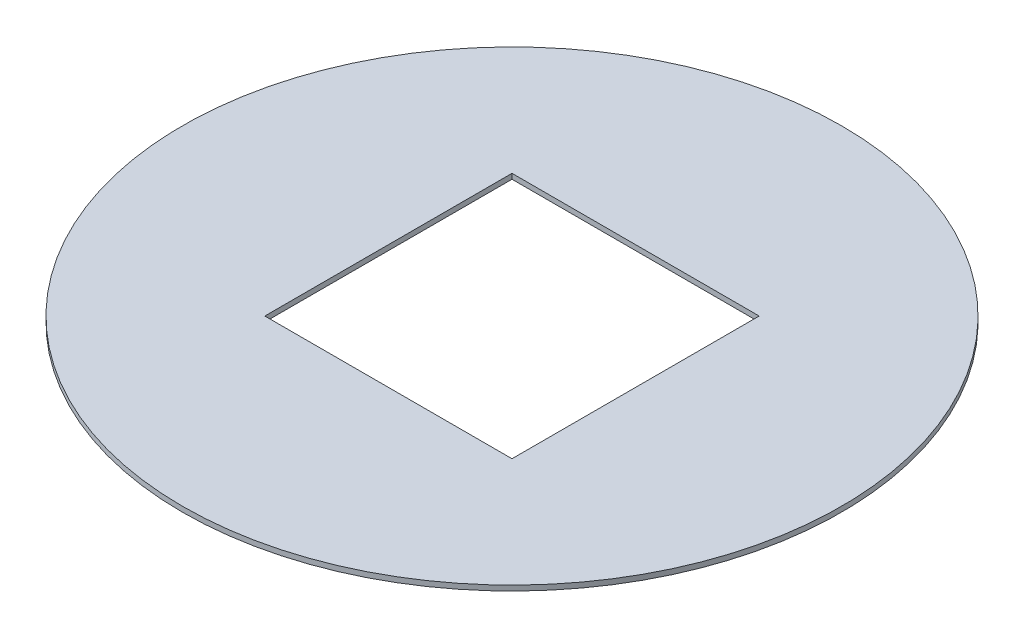
ISO-10303-21;
HEADER;
FILE_DESCRIPTION(('STEP AP214'),'2;1');
FILE_NAME('part.step','',(''),(''),'','','');
FILE_SCHEMA(('AUTOMOTIVE_DESIGN { 1 0 10303 214 1 1 1 1 }'));
ENDSEC;
DATA;
#1=APPLICATION_CONTEXT('core data for automotive mechanical design processes');
#2=APPLICATION_PROTOCOL_DEFINITION('international standard','automotive_design',2000,#1);
#3=PRODUCT_CONTEXT('',#1,'mechanical');
#4=PRODUCT('Part','Part','',(#3));
#5=PRODUCT_RELATED_PRODUCT_CATEGORY('part','',(#4));
#6=PRODUCT_DEFINITION_FORMATION('','',#4);
#7=PRODUCT_DEFINITION_CONTEXT('part definition',#1,'design');
#8=PRODUCT_DEFINITION('design','',#6,#7);
#9=PRODUCT_DEFINITION_SHAPE('','',#8);
#10=(LENGTH_UNIT() NAMED_UNIT(*) SI_UNIT(.MILLI.,.METRE.));
#11=(NAMED_UNIT(*) PLANE_ANGLE_UNIT() SI_UNIT($,.RADIAN.));
#12=(NAMED_UNIT(*) SI_UNIT($,.STERADIAN.) SOLID_ANGLE_UNIT());
#13=UNCERTAINTY_MEASURE_WITH_UNIT(LENGTH_MEASURE(1.E-05),#10,'distance_accuracy_value','');
#14=(GEOMETRIC_REPRESENTATION_CONTEXT(3) GLOBAL_UNCERTAINTY_ASSIGNED_CONTEXT((#13)) GLOBAL_UNIT_ASSIGNED_CONTEXT((#10,
#11,#12)) REPRESENTATION_CONTEXT('',''));
#15=CARTESIAN_POINT('',(0.,0.,0.));
#16=DIRECTION('',(0.,0.,1.));
#17=DIRECTION('',(1.,0.,0.));
#18=AXIS2_PLACEMENT_3D('',#15,#16,#17);
#19=CARTESIAN_POINT('',(-60.,-0.785000000000001,0.));
#20=DIRECTION('',(0.,1.,0.));
#21=DIRECTION('',(0.,0.,1.));
#22=AXIS2_PLACEMENT_3D('',#19,#20,#21);
#23=PLANE('',#22);
#24=CARTESIAN_POINT('',(0.,-0.785000000007585,0.));
#25=DIRECTION('',(0.,-1.,0.));
#26=DIRECTION('',(0.,0.,-1.));
#27=AXIS2_PLACEMENT_3D('',#24,#25,#26);
#28=CIRCLE('',#27,100.);
#29=CARTESIAN_POINT('',(0.,-0.785000000007585,-100.));
#30=VERTEX_POINT('',#29);
#31=EDGE_CURVE('E11',#30,#30,#28,.T.);
#32=ORIENTED_EDGE('',*,*,#31,.T.);
#33=EDGE_LOOP('',(#32));
#34=FACE_BOUND('',#33,.T.);
#35=DIRECTION('',(1.,0.,0.));
#36=VECTOR('',#35,1.);
#37=CARTESIAN_POINT('',(-37.5,-0.785000000000008,-37.5));
#38=LINE('',#37,#36);
#39=CARTESIAN_POINT('',(-37.5,-0.785000000000008,-37.5));
#40=VERTEX_POINT('',#39);
#41=CARTESIAN_POINT('',(37.5,-0.785000000000008,-37.5));
#42=VERTEX_POINT('',#41);
#43=EDGE_CURVE('E53',#40,#42,#38,.T.);
#44=ORIENTED_EDGE('',*,*,#43,.F.);
#45=DIRECTION('',(0.,0.,-1.));
#46=VECTOR('',#45,1.);
#47=CARTESIAN_POINT('',(-37.5,-0.785000000000008,37.5));
#48=LINE('',#47,#46);
#49=CARTESIAN_POINT('',(-37.5,-0.785000000000008,37.5));
#50=VERTEX_POINT('',#49);
#51=EDGE_CURVE('E57',#50,#40,#48,.T.);
#52=ORIENTED_EDGE('',*,*,#51,.F.);
#53=DIRECTION('',(-1.,0.,0.));
#54=VECTOR('',#53,1.);
#55=CARTESIAN_POINT('',(-37.5,-0.785000000000008,37.5));
#56=LINE('',#55,#54);
#57=CARTESIAN_POINT('',(37.5,-0.785000000000008,37.5));
#58=VERTEX_POINT('',#57);
#59=EDGE_CURVE('E111',#58,#50,#56,.T.);
#60=ORIENTED_EDGE('',*,*,#59,.F.);
#61=DIRECTION('',(0.,0.,1.));
#62=VECTOR('',#61,1.);
#63=CARTESIAN_POINT('',(37.5,-0.785000000000008,37.5));
#64=LINE('',#63,#62);
#65=EDGE_CURVE('E107',#42,#58,#64,.T.);
#66=ORIENTED_EDGE('',*,*,#65,.F.);
#67=EDGE_LOOP('',(#44,#52,#60,#66));
#68=FACE_BOUND('',#67,.T.);
#69=ADVANCED_FACE('F39',(#34,#68),#23,.F.);
#70=CARTESIAN_POINT('',(0.,-200069.047495165,0.));
#71=DIRECTION('',(0.,-1.,0.));
#72=DIRECTION('',(0.,0.,-1.));
#73=AXIS2_PLACEMENT_3D('',#70,#71,#72);
#74=CYLINDRICAL_SURFACE('',#73,100.);
#75=ORIENTED_EDGE('',*,*,#31,.F.);
#76=EDGE_LOOP('',(#75));
#77=FACE_BOUND('',#76,.T.);
#78=CARTESIAN_POINT('',(0.,0.785000000007585,0.));
#79=DIRECTION('',(0.,-1.,0.));
#80=DIRECTION('',(0.,0.,-1.));
#81=AXIS2_PLACEMENT_3D('',#78,#79,#80);
#82=CIRCLE('',#81,100.);
#83=CARTESIAN_POINT('',(0.,0.785000000007585,-100.));
#84=VERTEX_POINT('',#83);
#85=EDGE_CURVE('E46',#84,#84,#82,.T.);
#86=ORIENTED_EDGE('',*,*,#85,.T.);
#87=EDGE_LOOP('',(#86));
#88=FACE_BOUND('',#87,.T.);
#89=ADVANCED_FACE('F123',(#77,#88),#74,.T.);
#90=CARTESIAN_POINT('',(-60.,0.785000000000001,0.));
#91=DIRECTION('',(0.,-1.,0.));
#92=DIRECTION('',(0.,0.,-1.));
#93=AXIS2_PLACEMENT_3D('',#90,#91,#92);
#94=PLANE('',#93);
#95=ORIENTED_EDGE('',*,*,#85,.F.);
#96=EDGE_LOOP('',(#95));
#97=FACE_BOUND('',#96,.T.);
#98=DIRECTION('',(0.,0.,-1.));
#99=VECTOR('',#98,1.);
#100=CARTESIAN_POINT('',(37.5,0.785000000000001,37.5));
#101=LINE('',#100,#99);
#102=CARTESIAN_POINT('',(37.5,0.785000000000001,37.5));
#103=VERTEX_POINT('',#102);
#104=CARTESIAN_POINT('',(37.5,0.785000000000001,-37.5));
#105=VERTEX_POINT('',#104);
#106=EDGE_CURVE('E94',#103,#105,#101,.T.);
#107=ORIENTED_EDGE('',*,*,#106,.F.);
#108=DIRECTION('',(1.,0.,0.));
#109=VECTOR('',#108,1.);
#110=CARTESIAN_POINT('',(-37.5,0.785000000000001,37.5));
#111=LINE('',#110,#109);
#112=CARTESIAN_POINT('',(-37.5,0.785000000000001,37.5));
#113=VERTEX_POINT('',#112);
#114=EDGE_CURVE('E98',#113,#103,#111,.T.);
#115=ORIENTED_EDGE('',*,*,#114,.F.);
#116=DIRECTION('',(0.,0.,1.));
#117=VECTOR('',#116,1.);
#118=CARTESIAN_POINT('',(-37.5,0.785000000000001,37.5));
#119=LINE('',#118,#117);
#120=CARTESIAN_POINT('',(-37.5,0.785000000000001,-37.5));
#121=VERTEX_POINT('',#120);
#122=EDGE_CURVE('E81',#121,#113,#119,.T.);
#123=ORIENTED_EDGE('',*,*,#122,.F.);
#124=DIRECTION('',(-1.,0.,0.));
#125=VECTOR('',#124,1.);
#126=CARTESIAN_POINT('',(-37.5,0.785000000000001,-37.5));
#127=LINE('',#126,#125);
#128=EDGE_CURVE('E88',#105,#121,#127,.T.);
#129=ORIENTED_EDGE('',*,*,#128,.F.);
#130=EDGE_LOOP('',(#107,#115,#123,#129));
#131=FACE_BOUND('',#130,.T.);
#132=ADVANCED_FACE('F96',(#97,#131),#94,.F.);
#133=CARTESIAN_POINT('',(-37.5,-170.490627484771,-37.5));
#134=DIRECTION('',(0.,0.,-1.));
#135=DIRECTION('',(-1.,0.,0.));
#136=AXIS2_PLACEMENT_3D('',#133,#134,#135);
#137=PLANE('',#136);
#138=DIRECTION('',(0.,1.,0.));
#139=VECTOR('',#138,1.);
#140=CARTESIAN_POINT('',(-37.5,-170.490627484771,-37.5));
#141=LINE('',#140,#139);
#142=EDGE_CURVE('E77',#40,#121,#141,.T.);
#143=ORIENTED_EDGE('',*,*,#142,.F.);
#144=ORIENTED_EDGE('',*,*,#43,.T.);
#145=DIRECTION('',(0.,1.,0.));
#146=VECTOR('',#145,1.);
#147=CARTESIAN_POINT('',(37.5,-170.490627484771,-37.5));
#148=LINE('',#147,#146);
#149=EDGE_CURVE('E85',#42,#105,#148,.T.);
#150=ORIENTED_EDGE('',*,*,#149,.T.);
#151=ORIENTED_EDGE('',*,*,#128,.T.);
#152=EDGE_LOOP('',(#143,#144,#150,#151));
#153=FACE_BOUND('',#152,.T.);
#154=ADVANCED_FACE('F89',(#153),#137,.F.);
#155=CARTESIAN_POINT('',(-37.5,-170.490627484771,37.5));
#156=DIRECTION('',(-1.,0.,0.));
#157=DIRECTION('',(0.,0.,1.));
#158=AXIS2_PLACEMENT_3D('',#155,#156,#157);
#159=PLANE('',#158);
#160=DIRECTION('',(0.,1.,0.));
#161=VECTOR('',#160,1.);
#162=CARTESIAN_POINT('',(-37.5,-170.490627484771,37.5));
#163=LINE('',#162,#161);
#164=EDGE_CURVE('E84',#50,#113,#163,.T.);
#165=ORIENTED_EDGE('',*,*,#164,.F.);
#166=ORIENTED_EDGE('',*,*,#51,.T.);
#167=ORIENTED_EDGE('',*,*,#142,.T.);
#168=ORIENTED_EDGE('',*,*,#122,.T.);
#169=EDGE_LOOP('',(#165,#166,#167,#168));
#170=FACE_BOUND('',#169,.T.);
#171=ADVANCED_FACE('F79',(#170),#159,.F.);
#172=CARTESIAN_POINT('',(-37.5,-170.490627484771,37.5));
#173=DIRECTION('',(0.,0.,1.));
#174=DIRECTION('',(1.,0.,0.));
#175=AXIS2_PLACEMENT_3D('',#172,#173,#174);
#176=PLANE('',#175);
#177=DIRECTION('',(0.,1.,0.));
#178=VECTOR('',#177,1.);
#179=CARTESIAN_POINT('',(37.5,-170.490627484771,37.5));
#180=LINE('',#179,#178);
#181=EDGE_CURVE('E103',#58,#103,#180,.T.);
#182=ORIENTED_EDGE('',*,*,#181,.F.);
#183=ORIENTED_EDGE('',*,*,#59,.T.);
#184=ORIENTED_EDGE('',*,*,#164,.T.);
#185=ORIENTED_EDGE('',*,*,#114,.T.);
#186=EDGE_LOOP('',(#182,#183,#184,#185));
#187=FACE_BOUND('',#186,.T.);
#188=ADVANCED_FACE('F121',(#187),#176,.F.);
#189=CARTESIAN_POINT('',(37.5,-170.490627484771,37.5));
#190=DIRECTION('',(1.,0.,0.));
#191=DIRECTION('',(0.,0.,-1.));
#192=AXIS2_PLACEMENT_3D('',#189,#190,#191);
#193=PLANE('',#192);
#194=ORIENTED_EDGE('',*,*,#149,.F.);
#195=ORIENTED_EDGE('',*,*,#65,.T.);
#196=ORIENTED_EDGE('',*,*,#181,.T.);
#197=ORIENTED_EDGE('',*,*,#106,.T.);
#198=EDGE_LOOP('',(#194,#195,#196,#197));
#199=FACE_BOUND('',#198,.T.);
#200=ADVANCED_FACE('F118',(#199),#193,.F.);
#201=CLOSED_SHELL('',(#69,#89,#132,#154,#171,#188,#200));
#202=MANIFOLD_SOLID_BREP('B2',#201);
#203=ADVANCED_BREP_SHAPE_REPRESENTATION('',(#18,#202),#14);
#204=SHAPE_DEFINITION_REPRESENTATION(#9,#203);
ENDSEC;
END-ISO-10303-21;
